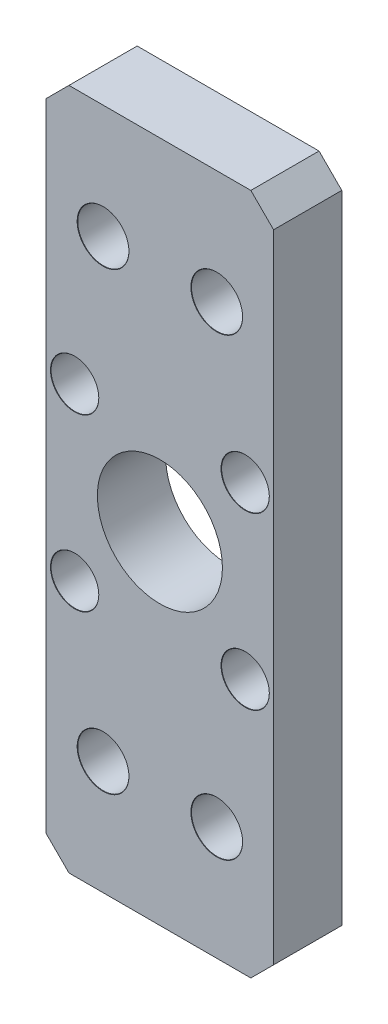
ISO-10303-21;
HEADER;
FILE_DESCRIPTION(('STEP AP214'),'2;1');
FILE_NAME('part.step','',(''),(''),'','','');
FILE_SCHEMA(('AUTOMOTIVE_DESIGN { 1 0 10303 214 1 1 1 1 }'));
ENDSEC;
DATA;
#1=APPLICATION_CONTEXT('core data for automotive mechanical design processes');
#2=APPLICATION_PROTOCOL_DEFINITION('international standard','automotive_design',2000,#1);
#3=PRODUCT_CONTEXT('',#1,'mechanical');
#4=PRODUCT('Part','Part','',(#3));
#5=PRODUCT_RELATED_PRODUCT_CATEGORY('part','',(#4));
#6=PRODUCT_DEFINITION_FORMATION('','',#4);
#7=PRODUCT_DEFINITION_CONTEXT('part definition',#1,'design');
#8=PRODUCT_DEFINITION('design','',#6,#7);
#9=PRODUCT_DEFINITION_SHAPE('','',#8);
#10=(LENGTH_UNIT() NAMED_UNIT(*) SI_UNIT(.MILLI.,.METRE.));
#11=(NAMED_UNIT(*) PLANE_ANGLE_UNIT() SI_UNIT($,.RADIAN.));
#12=(NAMED_UNIT(*) SI_UNIT($,.STERADIAN.) SOLID_ANGLE_UNIT());
#13=UNCERTAINTY_MEASURE_WITH_UNIT(LENGTH_MEASURE(1.E-05),#10,'distance_accuracy_value','');
#14=(GEOMETRIC_REPRESENTATION_CONTEXT(3) GLOBAL_UNCERTAINTY_ASSIGNED_CONTEXT((#13)) GLOBAL_UNIT_ASSIGNED_CONTEXT((#10,
#11,#12)) REPRESENTATION_CONTEXT('',''));
#15=CARTESIAN_POINT('',(0.,0.,0.));
#16=DIRECTION('',(0.,0.,1.));
#17=DIRECTION('',(1.,0.,0.));
#18=AXIS2_PLACEMENT_3D('',#15,#16,#17);
#19=CARTESIAN_POINT('',(10.,-30.,6.));
#20=DIRECTION('',(-1.,0.,0.));
#21=DIRECTION('',(0.,0.,1.));
#22=AXIS2_PLACEMENT_3D('',#19,#20,#21);
#23=PLANE('',#22);
#24=DIRECTION('',(0.,1.,0.));
#25=VECTOR('',#24,1.);
#26=CARTESIAN_POINT('',(10.,-30.,6.));
#27=LINE('',#26,#25);
#28=CARTESIAN_POINT('',(10.,-28.,6.));
#29=VERTEX_POINT('',#28);
#30=CARTESIAN_POINT('',(10.,28.,6.));
#31=VERTEX_POINT('',#30);
#32=EDGE_CURVE('E130',#29,#31,#27,.T.);
#33=ORIENTED_EDGE('',*,*,#32,.F.);
#34=DIRECTION('',(0.,0.,-1.));
#35=VECTOR('',#34,1.);
#36=CARTESIAN_POINT('',(10.,-28.,6.));
#37=LINE('',#36,#35);
#38=CARTESIAN_POINT('',(10.,-28.,0.));
#39=VERTEX_POINT('',#38);
#40=EDGE_CURVE('E114',#29,#39,#37,.T.);
#41=ORIENTED_EDGE('',*,*,#40,.T.);
#42=DIRECTION('',(0.,1.,0.));
#43=VECTOR('',#42,1.);
#44=CARTESIAN_POINT('',(10.,-30.,0.));
#45=LINE('',#44,#43);
#46=CARTESIAN_POINT('',(10.,28.,0.));
#47=VERTEX_POINT('',#46);
#48=EDGE_CURVE('E127',#39,#47,#45,.T.);
#49=ORIENTED_EDGE('',*,*,#48,.T.);
#50=DIRECTION('',(0.,0.,1.));
#51=VECTOR('',#50,1.);
#52=CARTESIAN_POINT('',(10.,28.,6.));
#53=LINE('',#52,#51);
#54=EDGE_CURVE('E133',#47,#31,#53,.T.);
#55=ORIENTED_EDGE('',*,*,#54,.T.);
#56=EDGE_LOOP('',(#33,#41,#49,#55));
#57=FACE_BOUND('',#56,.T.);
#58=ADVANCED_FACE('F41',(#57),#23,.F.);
#59=CARTESIAN_POINT('',(-10.,30.,6.));
#60=DIRECTION('',(0.,-1.,0.));
#61=DIRECTION('',(0.,0.,-1.));
#62=AXIS2_PLACEMENT_3D('',#59,#60,#61);
#63=PLANE('',#62);
#64=DIRECTION('',(-1.,0.,0.));
#65=VECTOR('',#64,1.);
#66=CARTESIAN_POINT('',(-10.,30.,6.));
#67=LINE('',#66,#65);
#68=CARTESIAN_POINT('',(8.,30.,6.));
#69=VERTEX_POINT('',#68);
#70=CARTESIAN_POINT('',(-8.,30.,6.));
#71=VERTEX_POINT('',#70);
#72=EDGE_CURVE('E193',#69,#71,#67,.T.);
#73=ORIENTED_EDGE('',*,*,#72,.F.);
#74=DIRECTION('',(0.,0.,-1.));
#75=VECTOR('',#74,1.);
#76=CARTESIAN_POINT('',(8.,30.,6.));
#77=LINE('',#76,#75);
#78=CARTESIAN_POINT('',(8.,30.,0.));
#79=VERTEX_POINT('',#78);
#80=EDGE_CURVE('E11',#69,#79,#77,.T.);
#81=ORIENTED_EDGE('',*,*,#80,.T.);
#82=DIRECTION('',(-1.,0.,0.));
#83=VECTOR('',#82,1.);
#84=CARTESIAN_POINT('',(-10.,30.,0.));
#85=LINE('',#84,#83);
#86=CARTESIAN_POINT('',(-8.,30.,0.));
#87=VERTEX_POINT('',#86);
#88=EDGE_CURVE('E139',#79,#87,#85,.T.);
#89=ORIENTED_EDGE('',*,*,#88,.T.);
#90=DIRECTION('',(0.,0.,1.));
#91=VECTOR('',#90,1.);
#92=CARTESIAN_POINT('',(-8.,30.,6.));
#93=LINE('',#92,#91);
#94=EDGE_CURVE('E51',#87,#71,#93,.T.);
#95=ORIENTED_EDGE('',*,*,#94,.T.);
#96=EDGE_LOOP('',(#73,#81,#89,#95));
#97=FACE_BOUND('',#96,.T.);
#98=ADVANCED_FACE('F192',(#97),#63,.F.);
#99=CARTESIAN_POINT('',(-10.,-30.,6.));
#100=DIRECTION('',(1.,0.,0.));
#101=DIRECTION('',(0.,0.,-1.));
#102=AXIS2_PLACEMENT_3D('',#99,#100,#101);
#103=PLANE('',#102);
#104=DIRECTION('',(0.,-1.,0.));
#105=VECTOR('',#104,1.);
#106=CARTESIAN_POINT('',(-10.,-30.,0.));
#107=LINE('',#106,#105);
#108=CARTESIAN_POINT('',(-10.,28.,0.));
#109=VERTEX_POINT('',#108);
#110=CARTESIAN_POINT('',(-10.,-28.,0.));
#111=VERTEX_POINT('',#110);
#112=EDGE_CURVE('E145',#109,#111,#107,.T.);
#113=ORIENTED_EDGE('',*,*,#112,.T.);
#114=DIRECTION('',(0.,0.,1.));
#115=VECTOR('',#114,1.);
#116=CARTESIAN_POINT('',(-10.,-28.,6.));
#117=LINE('',#116,#115);
#118=CARTESIAN_POINT('',(-10.,-28.,6.));
#119=VERTEX_POINT('',#118);
#120=EDGE_CURVE('E58',#111,#119,#117,.T.);
#121=ORIENTED_EDGE('',*,*,#120,.T.);
#122=DIRECTION('',(0.,-1.,0.));
#123=VECTOR('',#122,1.);
#124=CARTESIAN_POINT('',(-10.,-30.,6.));
#125=LINE('',#124,#123);
#126=CARTESIAN_POINT('',(-10.,28.,6.));
#127=VERTEX_POINT('',#126);
#128=EDGE_CURVE('E200',#127,#119,#125,.T.);
#129=ORIENTED_EDGE('',*,*,#128,.F.);
#130=DIRECTION('',(0.,0.,-1.));
#131=VECTOR('',#130,1.);
#132=CARTESIAN_POINT('',(-10.,28.,6.));
#133=LINE('',#132,#131);
#134=EDGE_CURVE('E183',#127,#109,#133,.T.);
#135=ORIENTED_EDGE('',*,*,#134,.T.);
#136=EDGE_LOOP('',(#113,#121,#129,#135));
#137=FACE_BOUND('',#136,.T.);
#138=ADVANCED_FACE('F204',(#137),#103,.F.);
#139=CARTESIAN_POINT('',(-10.,-30.,6.));
#140=DIRECTION('',(0.,1.,0.));
#141=DIRECTION('',(0.,0.,1.));
#142=AXIS2_PLACEMENT_3D('',#139,#140,#141);
#143=PLANE('',#142);
#144=DIRECTION('',(1.,0.,0.));
#145=VECTOR('',#144,1.);
#146=CARTESIAN_POINT('',(-10.,-30.,0.));
#147=LINE('',#146,#145);
#148=CARTESIAN_POINT('',(-8.,-30.,0.));
#149=VERTEX_POINT('',#148);
#150=CARTESIAN_POINT('',(8.,-30.,0.));
#151=VERTEX_POINT('',#150);
#152=EDGE_CURVE('E156',#149,#151,#147,.T.);
#153=ORIENTED_EDGE('',*,*,#152,.T.);
#154=DIRECTION('',(0.,0.,1.));
#155=VECTOR('',#154,1.);
#156=CARTESIAN_POINT('',(8.,-30.,6.));
#157=LINE('',#156,#155);
#158=CARTESIAN_POINT('',(8.,-30.,6.));
#159=VERTEX_POINT('',#158);
#160=EDGE_CURVE('E115',#151,#159,#157,.T.);
#161=ORIENTED_EDGE('',*,*,#160,.T.);
#162=DIRECTION('',(1.,0.,0.));
#163=VECTOR('',#162,1.);
#164=CARTESIAN_POINT('',(-10.,-30.,6.));
#165=LINE('',#164,#163);
#166=CARTESIAN_POINT('',(-8.,-30.,6.));
#167=VERTEX_POINT('',#166);
#168=EDGE_CURVE('E151',#167,#159,#165,.T.);
#169=ORIENTED_EDGE('',*,*,#168,.F.);
#170=DIRECTION('',(0.,0.,-1.));
#171=VECTOR('',#170,1.);
#172=CARTESIAN_POINT('',(-8.,-30.,6.));
#173=LINE('',#172,#171);
#174=EDGE_CURVE('E121',#167,#149,#173,.T.);
#175=ORIENTED_EDGE('',*,*,#174,.T.);
#176=EDGE_LOOP('',(#153,#161,#169,#175));
#177=FACE_BOUND('',#176,.T.);
#178=ADVANCED_FACE('F211',(#177),#143,.F.);
#179=CARTESIAN_POINT('',(0.,0.,6.));
#180=DIRECTION('',(0.,0.,-1.));
#181=DIRECTION('',(-1.,0.,0.));
#182=AXIS2_PLACEMENT_3D('',#179,#180,#181);
#183=PLANE('',#182);
#184=CARTESIAN_POINT('',(-7.5,7.5,6.));
#185=DIRECTION('',(0.,0.,1.));
#186=DIRECTION('',(1.,0.,0.));
#187=AXIS2_PLACEMENT_3D('',#184,#185,#186);
#188=CIRCLE('',#187,2.125);
#189=CARTESIAN_POINT('',(-5.375,7.5,6.));
#190=VERTEX_POINT('',#189);
#191=EDGE_CURVE('E312',#190,#190,#188,.T.);
#192=ORIENTED_EDGE('',*,*,#191,.F.);
#193=EDGE_LOOP('',(#192));
#194=FACE_BOUND('',#193,.T.);
#195=CARTESIAN_POINT('',(7.5,7.5,6.));
#196=DIRECTION('',(0.,0.,1.));
#197=DIRECTION('',(1.,0.,0.));
#198=AXIS2_PLACEMENT_3D('',#195,#196,#197);
#199=CIRCLE('',#198,2.125);
#200=CARTESIAN_POINT('',(9.625,7.5,6.));
#201=VERTEX_POINT('',#200);
#202=EDGE_CURVE('E300',#201,#201,#199,.T.);
#203=ORIENTED_EDGE('',*,*,#202,.F.);
#204=EDGE_LOOP('',(#203));
#205=FACE_BOUND('',#204,.T.);
#206=CARTESIAN_POINT('',(7.5,-7.5,6.));
#207=DIRECTION('',(0.,0.,1.));
#208=DIRECTION('',(1.,0.,0.));
#209=AXIS2_PLACEMENT_3D('',#206,#207,#208);
#210=CIRCLE('',#209,2.125);
#211=CARTESIAN_POINT('',(9.625,-7.5,6.));
#212=VERTEX_POINT('',#211);
#213=EDGE_CURVE('E288',#212,#212,#210,.T.);
#214=ORIENTED_EDGE('',*,*,#213,.F.);
#215=EDGE_LOOP('',(#214));
#216=FACE_BOUND('',#215,.T.);
#217=CARTESIAN_POINT('',(-7.5,-7.5,6.));
#218=DIRECTION('',(0.,0.,1.));
#219=DIRECTION('',(1.,0.,0.));
#220=AXIS2_PLACEMENT_3D('',#217,#218,#219);
#221=CIRCLE('',#220,2.125);
#222=CARTESIAN_POINT('',(-5.375,-7.5,6.));
#223=VERTEX_POINT('',#222);
#224=EDGE_CURVE('E276',#223,#223,#221,.T.);
#225=ORIENTED_EDGE('',*,*,#224,.F.);
#226=EDGE_LOOP('',(#225));
#227=FACE_BOUND('',#226,.T.);
#228=CARTESIAN_POINT('',(0.,0.,6.));
#229=DIRECTION('',(0.,0.,1.));
#230=DIRECTION('',(1.,0.,0.));
#231=AXIS2_PLACEMENT_3D('',#228,#229,#230);
#232=CIRCLE('',#231,5.5);
#233=CARTESIAN_POINT('',(5.5,0.,6.));
#234=VERTEX_POINT('',#233);
#235=EDGE_CURVE('E261',#234,#234,#232,.T.);
#236=ORIENTED_EDGE('',*,*,#235,.F.);
#237=EDGE_LOOP('',(#236));
#238=FACE_BOUND('',#237,.T.);
#239=CARTESIAN_POINT('',(-5.,-20.,6.));
#240=DIRECTION('',(0.,0.,1.));
#241=DIRECTION('',(1.,0.,0.));
#242=AXIS2_PLACEMENT_3D('',#239,#240,#241);
#243=CIRCLE('',#242,2.275);
#244=CARTESIAN_POINT('',(-2.725,-20.,6.));
#245=VERTEX_POINT('',#244);
#246=EDGE_CURVE('E256',#245,#245,#243,.T.);
#247=ORIENTED_EDGE('',*,*,#246,.F.);
#248=EDGE_LOOP('',(#247));
#249=FACE_BOUND('',#248,.T.);
#250=CARTESIAN_POINT('',(5.,-20.,6.));
#251=DIRECTION('',(0.,0.,1.));
#252=DIRECTION('',(1.,0.,0.));
#253=AXIS2_PLACEMENT_3D('',#250,#251,#252);
#254=CIRCLE('',#253,2.275);
#255=CARTESIAN_POINT('',(7.275,-20.,6.));
#256=VERTEX_POINT('',#255);
#257=EDGE_CURVE('E244',#256,#256,#254,.T.);
#258=ORIENTED_EDGE('',*,*,#257,.F.);
#259=EDGE_LOOP('',(#258));
#260=FACE_BOUND('',#259,.T.);
#261=CARTESIAN_POINT('',(-5.,20.,6.));
#262=DIRECTION('',(0.,0.,1.));
#263=DIRECTION('',(1.,0.,0.));
#264=AXIS2_PLACEMENT_3D('',#261,#262,#263);
#265=CIRCLE('',#264,2.275);
#266=CARTESIAN_POINT('',(-2.725,20.,6.));
#267=VERTEX_POINT('',#266);
#268=EDGE_CURVE('E232',#267,#267,#265,.T.);
#269=ORIENTED_EDGE('',*,*,#268,.F.);
#270=EDGE_LOOP('',(#269));
#271=FACE_BOUND('',#270,.T.);
#272=CARTESIAN_POINT('',(5.,20.,6.));
#273=DIRECTION('',(0.,0.,1.));
#274=DIRECTION('',(1.,0.,0.));
#275=AXIS2_PLACEMENT_3D('',#272,#273,#274);
#276=CIRCLE('',#275,2.275);
#277=CARTESIAN_POINT('',(7.275,20.,6.));
#278=VERTEX_POINT('',#277);
#279=EDGE_CURVE('E220',#278,#278,#276,.T.);
#280=ORIENTED_EDGE('',*,*,#279,.F.);
#281=EDGE_LOOP('',(#280));
#282=FACE_BOUND('',#281,.T.);
#283=ORIENTED_EDGE('',*,*,#168,.T.);
#284=DIRECTION('',(-0.707106781186548,-0.707106781186548,0.));
#285=VECTOR('',#284,1.);
#286=CARTESIAN_POINT('',(10.,-28.,6.));
#287=LINE('',#286,#285);
#288=EDGE_CURVE('E180',#159,#29,#287,.F.);
#289=ORIENTED_EDGE('',*,*,#288,.T.);
#290=ORIENTED_EDGE('',*,*,#32,.T.);
#291=DIRECTION('',(0.707106781186548,-0.707106781186548,0.));
#292=VECTOR('',#291,1.);
#293=CARTESIAN_POINT('',(8.,30.,6.));
#294=LINE('',#293,#292);
#295=EDGE_CURVE('E174',#31,#69,#294,.F.);
#296=ORIENTED_EDGE('',*,*,#295,.T.);
#297=ORIENTED_EDGE('',*,*,#72,.T.);
#298=DIRECTION('',(0.707106781186548,0.707106781186548,0.));
#299=VECTOR('',#298,1.);
#300=CARTESIAN_POINT('',(-10.,28.,6.));
#301=LINE('',#300,#299);
#302=EDGE_CURVE('E65',#71,#127,#301,.F.);
#303=ORIENTED_EDGE('',*,*,#302,.T.);
#304=ORIENTED_EDGE('',*,*,#128,.T.);
#305=DIRECTION('',(-0.707106781186548,0.707106781186548,0.));
#306=VECTOR('',#305,1.);
#307=CARTESIAN_POINT('',(-8.,-30.,6.));
#308=LINE('',#307,#306);
#309=EDGE_CURVE('E177',#119,#167,#308,.F.);
#310=ORIENTED_EDGE('',*,*,#309,.T.);
#311=EDGE_LOOP('',(#283,#289,#290,#296,#297,#303,#304,#310));
#312=FACE_BOUND('',#311,.T.);
#313=ADVANCED_FACE('F197',(#194,#205,#216,#227,#238,#249,#260,#271,#282,#312),#183,.F.);
#314=CARTESIAN_POINT('',(0.,0.,0.));
#315=DIRECTION('',(0.,0.,-1.));
#316=DIRECTION('',(-1.,0.,0.));
#317=AXIS2_PLACEMENT_3D('',#314,#315,#316);
#318=PLANE('',#317);
#319=CARTESIAN_POINT('',(-7.5,7.5,0.));
#320=DIRECTION('',(0.,0.,1.));
#321=DIRECTION('',(1.,0.,0.));
#322=AXIS2_PLACEMENT_3D('',#319,#320,#321);
#323=CIRCLE('',#322,2.1);
#324=CARTESIAN_POINT('',(-5.4,7.5,0.));
#325=VERTEX_POINT('',#324);
#326=EDGE_CURVE('E304',#325,#325,#323,.T.);
#327=ORIENTED_EDGE('',*,*,#326,.T.);
#328=EDGE_LOOP('',(#327));
#329=FACE_BOUND('',#328,.T.);
#330=CARTESIAN_POINT('',(7.5,7.5,0.));
#331=DIRECTION('',(0.,0.,1.));
#332=DIRECTION('',(1.,0.,0.));
#333=AXIS2_PLACEMENT_3D('',#330,#331,#332);
#334=CIRCLE('',#333,2.1);
#335=CARTESIAN_POINT('',(9.6,7.5,0.));
#336=VERTEX_POINT('',#335);
#337=EDGE_CURVE('E292',#336,#336,#334,.T.);
#338=ORIENTED_EDGE('',*,*,#337,.T.);
#339=EDGE_LOOP('',(#338));
#340=FACE_BOUND('',#339,.T.);
#341=CARTESIAN_POINT('',(7.5,-7.5,0.));
#342=DIRECTION('',(0.,0.,1.));
#343=DIRECTION('',(1.,0.,0.));
#344=AXIS2_PLACEMENT_3D('',#341,#342,#343);
#345=CIRCLE('',#344,2.1);
#346=CARTESIAN_POINT('',(9.6,-7.5,0.));
#347=VERTEX_POINT('',#346);
#348=EDGE_CURVE('E280',#347,#347,#345,.T.);
#349=ORIENTED_EDGE('',*,*,#348,.T.);
#350=EDGE_LOOP('',(#349));
#351=FACE_BOUND('',#350,.T.);
#352=CARTESIAN_POINT('',(-7.5,-7.5,0.));
#353=DIRECTION('',(0.,0.,1.));
#354=DIRECTION('',(1.,0.,0.));
#355=AXIS2_PLACEMENT_3D('',#352,#353,#354);
#356=CIRCLE('',#355,2.1);
#357=CARTESIAN_POINT('',(-5.4,-7.5,0.));
#358=VERTEX_POINT('',#357);
#359=EDGE_CURVE('E265',#358,#358,#356,.T.);
#360=ORIENTED_EDGE('',*,*,#359,.T.);
#361=EDGE_LOOP('',(#360));
#362=FACE_BOUND('',#361,.T.);
#363=CARTESIAN_POINT('',(0.,0.,0.));
#364=DIRECTION('',(0.,0.,1.));
#365=DIRECTION('',(1.,0.,0.));
#366=AXIS2_PLACEMENT_3D('',#363,#364,#365);
#367=CIRCLE('',#366,5.5);
#368=CARTESIAN_POINT('',(5.5,0.,0.));
#369=VERTEX_POINT('',#368);
#370=EDGE_CURVE('E260',#369,#369,#367,.T.);
#371=ORIENTED_EDGE('',*,*,#370,.T.);
#372=EDGE_LOOP('',(#371));
#373=FACE_BOUND('',#372,.T.);
#374=CARTESIAN_POINT('',(-5.,-20.,0.));
#375=DIRECTION('',(0.,0.,1.));
#376=DIRECTION('',(1.,0.,0.));
#377=AXIS2_PLACEMENT_3D('',#374,#375,#376);
#378=CIRCLE('',#377,2.25);
#379=CARTESIAN_POINT('',(-2.75,-20.,0.));
#380=VERTEX_POINT('',#379);
#381=EDGE_CURVE('E248',#380,#380,#378,.T.);
#382=ORIENTED_EDGE('',*,*,#381,.T.);
#383=EDGE_LOOP('',(#382));
#384=FACE_BOUND('',#383,.T.);
#385=CARTESIAN_POINT('',(5.,-20.,0.));
#386=DIRECTION('',(0.,0.,1.));
#387=DIRECTION('',(1.,0.,0.));
#388=AXIS2_PLACEMENT_3D('',#385,#386,#387);
#389=CIRCLE('',#388,2.25);
#390=CARTESIAN_POINT('',(7.25,-20.,0.));
#391=VERTEX_POINT('',#390);
#392=EDGE_CURVE('E236',#391,#391,#389,.T.);
#393=ORIENTED_EDGE('',*,*,#392,.T.);
#394=EDGE_LOOP('',(#393));
#395=FACE_BOUND('',#394,.T.);
#396=CARTESIAN_POINT('',(-5.,20.,0.));
#397=DIRECTION('',(0.,0.,1.));
#398=DIRECTION('',(1.,0.,0.));
#399=AXIS2_PLACEMENT_3D('',#396,#397,#398);
#400=CIRCLE('',#399,2.25);
#401=CARTESIAN_POINT('',(-2.75,20.,0.));
#402=VERTEX_POINT('',#401);
#403=EDGE_CURVE('E224',#402,#402,#400,.T.);
#404=ORIENTED_EDGE('',*,*,#403,.T.);
#405=EDGE_LOOP('',(#404));
#406=FACE_BOUND('',#405,.T.);
#407=CARTESIAN_POINT('',(5.,20.,0.));
#408=DIRECTION('',(0.,0.,1.));
#409=DIRECTION('',(1.,0.,0.));
#410=AXIS2_PLACEMENT_3D('',#407,#408,#409);
#411=CIRCLE('',#410,2.25);
#412=CARTESIAN_POINT('',(7.25,20.,0.));
#413=VERTEX_POINT('',#412);
#414=EDGE_CURVE('E140',#413,#413,#411,.T.);
#415=ORIENTED_EDGE('',*,*,#414,.T.);
#416=EDGE_LOOP('',(#415));
#417=FACE_BOUND('',#416,.T.);
#418=ORIENTED_EDGE('',*,*,#48,.F.);
#419=DIRECTION('',(0.707106781186548,0.707106781186548,0.));
#420=VECTOR('',#419,1.);
#421=CARTESIAN_POINT('',(19.,-19.,0.));
#422=LINE('',#421,#420);
#423=EDGE_CURVE('E110',#39,#151,#422,.F.);
#424=ORIENTED_EDGE('',*,*,#423,.T.);
#425=ORIENTED_EDGE('',*,*,#152,.F.);
#426=DIRECTION('',(0.707106781186548,-0.707106781186548,0.));
#427=VECTOR('',#426,1.);
#428=CARTESIAN_POINT('',(-19.,-19.,0.));
#429=LINE('',#428,#427);
#430=EDGE_CURVE('E122',#149,#111,#429,.F.);
#431=ORIENTED_EDGE('',*,*,#430,.T.);
#432=ORIENTED_EDGE('',*,*,#112,.F.);
#433=DIRECTION('',(-0.707106781186548,-0.707106781186548,0.));
#434=VECTOR('',#433,1.);
#435=CARTESIAN_POINT('',(-19.,19.,0.));
#436=LINE('',#435,#434);
#437=EDGE_CURVE('E132',#109,#87,#436,.F.);
#438=ORIENTED_EDGE('',*,*,#437,.T.);
#439=ORIENTED_EDGE('',*,*,#88,.F.);
#440=DIRECTION('',(-0.707106781186548,0.707106781186548,0.));
#441=VECTOR('',#440,1.);
#442=CARTESIAN_POINT('',(19.,19.,0.));
#443=LINE('',#442,#441);
#444=EDGE_CURVE('E137',#79,#47,#443,.F.);
#445=ORIENTED_EDGE('',*,*,#444,.T.);
#446=EDGE_LOOP('',(#418,#424,#425,#431,#432,#438,#439,#445));
#447=FACE_BOUND('',#446,.T.);
#448=ADVANCED_FACE('F135',(#329,#340,#351,#362,#373,#384,#395,#406,#417,#447),#318,.T.);
#449=CARTESIAN_POINT('',(5.,20.,6.));
#450=DIRECTION('',(0.,0.,1.));
#451=DIRECTION('',(1.,0.,0.));
#452=AXIS2_PLACEMENT_3D('',#449,#450,#451);
#453=CYLINDRICAL_SURFACE('',#452,2.25);
#454=ORIENTED_EDGE('',*,*,#414,.F.);
#455=EDGE_LOOP('',(#454));
#456=FACE_BOUND('',#455,.T.);
#457=CARTESIAN_POINT('',(5.,20.,5.975));
#458=DIRECTION('',(0.,0.,1.));
#459=DIRECTION('',(1.,0.,0.));
#460=AXIS2_PLACEMENT_3D('',#457,#458,#459);
#461=CIRCLE('',#460,2.25);
#462=CARTESIAN_POINT('',(7.25,20.,5.975));
#463=VERTEX_POINT('',#462);
#464=EDGE_CURVE('E148',#463,#463,#461,.T.);
#465=ORIENTED_EDGE('',*,*,#464,.T.);
#466=EDGE_LOOP('',(#465));
#467=FACE_BOUND('',#466,.T.);
#468=ADVANCED_FACE('F341',(#456,#467),#453,.F.);
#469=CARTESIAN_POINT('',(5.,20.,6.));
#470=DIRECTION('',(0.,0.,1.));
#471=DIRECTION('',(1.,0.,0.));
#472=AXIS2_PLACEMENT_3D('',#469,#470,#471);
#473=CONICAL_SURFACE('',#472,2.275,0.785398163397466);
#474=ORIENTED_EDGE('',*,*,#464,.F.);
#475=EDGE_LOOP('',(#474));
#476=FACE_BOUND('',#475,.T.);
#477=ORIENTED_EDGE('',*,*,#279,.T.);
#478=EDGE_LOOP('',(#477));
#479=FACE_BOUND('',#478,.T.);
#480=ADVANCED_FACE('F338',(#476,#479),#473,.F.);
#481=CARTESIAN_POINT('',(-5.,20.,6.));
#482=DIRECTION('',(0.,0.,1.));
#483=DIRECTION('',(1.,0.,0.));
#484=AXIS2_PLACEMENT_3D('',#481,#482,#483);
#485=CYLINDRICAL_SURFACE('',#484,2.25);
#486=ORIENTED_EDGE('',*,*,#403,.F.);
#487=EDGE_LOOP('',(#486));
#488=FACE_BOUND('',#487,.T.);
#489=CARTESIAN_POINT('',(-5.,20.,5.975));
#490=DIRECTION('',(0.,0.,1.));
#491=DIRECTION('',(1.,0.,0.));
#492=AXIS2_PLACEMENT_3D('',#489,#490,#491);
#493=CIRCLE('',#492,2.25);
#494=CARTESIAN_POINT('',(-2.75,20.,5.975));
#495=VERTEX_POINT('',#494);
#496=EDGE_CURVE('E228',#495,#495,#493,.T.);
#497=ORIENTED_EDGE('',*,*,#496,.T.);
#498=EDGE_LOOP('',(#497));
#499=FACE_BOUND('',#498,.T.);
#500=ADVANCED_FACE('F340',(#488,#499),#485,.F.);
#501=CARTESIAN_POINT('',(-5.,20.,6.));
#502=DIRECTION('',(0.,0.,1.));
#503=DIRECTION('',(1.,0.,0.));
#504=AXIS2_PLACEMENT_3D('',#501,#502,#503);
#505=CONICAL_SURFACE('',#504,2.275,0.785398163397457);
#506=ORIENTED_EDGE('',*,*,#496,.F.);
#507=EDGE_LOOP('',(#506));
#508=FACE_BOUND('',#507,.T.);
#509=ORIENTED_EDGE('',*,*,#268,.T.);
#510=EDGE_LOOP('',(#509));
#511=FACE_BOUND('',#510,.T.);
#512=ADVANCED_FACE('F348',(#508,#511),#505,.F.);
#513=CARTESIAN_POINT('',(5.,-20.,6.));
#514=DIRECTION('',(0.,0.,1.));
#515=DIRECTION('',(1.,0.,0.));
#516=AXIS2_PLACEMENT_3D('',#513,#514,#515);
#517=CYLINDRICAL_SURFACE('',#516,2.25);
#518=ORIENTED_EDGE('',*,*,#392,.F.);
#519=EDGE_LOOP('',(#518));
#520=FACE_BOUND('',#519,.T.);
#521=CARTESIAN_POINT('',(5.,-20.,5.975));
#522=DIRECTION('',(0.,0.,1.));
#523=DIRECTION('',(1.,0.,0.));
#524=AXIS2_PLACEMENT_3D('',#521,#522,#523);
#525=CIRCLE('',#524,2.25);
#526=CARTESIAN_POINT('',(7.25,-20.,5.975));
#527=VERTEX_POINT('',#526);
#528=EDGE_CURVE('E240',#527,#527,#525,.T.);
#529=ORIENTED_EDGE('',*,*,#528,.T.);
#530=EDGE_LOOP('',(#529));
#531=FACE_BOUND('',#530,.T.);
#532=ADVANCED_FACE('F558',(#520,#531),#517,.F.);
#533=CARTESIAN_POINT('',(5.,-20.,6.));
#534=DIRECTION('',(0.,0.,1.));
#535=DIRECTION('',(1.,0.,0.));
#536=AXIS2_PLACEMENT_3D('',#533,#534,#535);
#537=CONICAL_SURFACE('',#536,2.275,0.785398163397466);
#538=ORIENTED_EDGE('',*,*,#528,.F.);
#539=EDGE_LOOP('',(#538));
#540=FACE_BOUND('',#539,.T.);
#541=ORIENTED_EDGE('',*,*,#257,.T.);
#542=EDGE_LOOP('',(#541));
#543=FACE_BOUND('',#542,.T.);
#544=ADVANCED_FACE('F548',(#540,#543),#537,.F.);
#545=CARTESIAN_POINT('',(-5.,-20.,6.));
#546=DIRECTION('',(0.,0.,1.));
#547=DIRECTION('',(1.,0.,0.));
#548=AXIS2_PLACEMENT_3D('',#545,#546,#547);
#549=CYLINDRICAL_SURFACE('',#548,2.25);
#550=ORIENTED_EDGE('',*,*,#381,.F.);
#551=EDGE_LOOP('',(#550));
#552=FACE_BOUND('',#551,.T.);
#553=CARTESIAN_POINT('',(-5.,-20.,5.975));
#554=DIRECTION('',(0.,0.,1.));
#555=DIRECTION('',(1.,0.,0.));
#556=AXIS2_PLACEMENT_3D('',#553,#554,#555);
#557=CIRCLE('',#556,2.25);
#558=CARTESIAN_POINT('',(-2.75,-20.,5.975));
#559=VERTEX_POINT('',#558);
#560=EDGE_CURVE('E252',#559,#559,#557,.T.);
#561=ORIENTED_EDGE('',*,*,#560,.T.);
#562=EDGE_LOOP('',(#561));
#563=FACE_BOUND('',#562,.T.);
#564=ADVANCED_FACE('F538',(#552,#563),#549,.F.);
#565=CARTESIAN_POINT('',(-5.,-20.,6.));
#566=DIRECTION('',(0.,0.,1.));
#567=DIRECTION('',(1.,0.,0.));
#568=AXIS2_PLACEMENT_3D('',#565,#566,#567);
#569=CONICAL_SURFACE('',#568,2.275,0.785398163397457);
#570=ORIENTED_EDGE('',*,*,#560,.F.);
#571=EDGE_LOOP('',(#570));
#572=FACE_BOUND('',#571,.T.);
#573=ORIENTED_EDGE('',*,*,#246,.T.);
#574=EDGE_LOOP('',(#573));
#575=FACE_BOUND('',#574,.T.);
#576=ADVANCED_FACE('F528',(#572,#575),#569,.F.);
#577=CARTESIAN_POINT('',(0.,0.,0.));
#578=DIRECTION('',(0.,0.,1.));
#579=DIRECTION('',(1.,0.,0.));
#580=AXIS2_PLACEMENT_3D('',#577,#578,#579);
#581=CYLINDRICAL_SURFACE('',#580,5.5);
#582=ORIENTED_EDGE('',*,*,#370,.F.);
#583=EDGE_LOOP('',(#582));
#584=FACE_BOUND('',#583,.T.);
#585=ORIENTED_EDGE('',*,*,#235,.T.);
#586=EDGE_LOOP('',(#585));
#587=FACE_BOUND('',#586,.T.);
#588=ADVANCED_FACE('F518',(#584,#587),#581,.F.);
#589=CARTESIAN_POINT('',(-7.5,-7.5,6.));
#590=DIRECTION('',(0.,0.,1.));
#591=DIRECTION('',(1.,0.,0.));
#592=AXIS2_PLACEMENT_3D('',#589,#590,#591);
#593=CYLINDRICAL_SURFACE('',#592,2.09999999999999);
#594=ORIENTED_EDGE('',*,*,#359,.F.);
#595=EDGE_LOOP('',(#594));
#596=FACE_BOUND('',#595,.T.);
#597=CARTESIAN_POINT('',(-7.5,-7.5,5.975));
#598=DIRECTION('',(0.,0.,1.));
#599=DIRECTION('',(1.,0.,0.));
#600=AXIS2_PLACEMENT_3D('',#597,#598,#599);
#601=CIRCLE('',#600,2.09999999999999);
#602=CARTESIAN_POINT('',(-5.40000000000001,-7.5,5.975));
#603=VERTEX_POINT('',#602);
#604=EDGE_CURVE('E272',#603,#603,#601,.T.);
#605=ORIENTED_EDGE('',*,*,#604,.T.);
#606=EDGE_LOOP('',(#605));
#607=FACE_BOUND('',#606,.T.);
#608=ADVANCED_FACE('F508',(#596,#607),#593,.F.);
#609=CARTESIAN_POINT('',(-7.5,-7.5,6.));
#610=DIRECTION('',(0.,0.,1.));
#611=DIRECTION('',(1.,0.,0.));
#612=AXIS2_PLACEMENT_3D('',#609,#610,#611);
#613=CONICAL_SURFACE('',#612,2.125,0.785398163397726);
#614=ORIENTED_EDGE('',*,*,#604,.F.);
#615=EDGE_LOOP('',(#614));
#616=FACE_BOUND('',#615,.T.);
#617=ORIENTED_EDGE('',*,*,#224,.T.);
#618=EDGE_LOOP('',(#617));
#619=FACE_BOUND('',#618,.T.);
#620=ADVANCED_FACE('F498',(#616,#619),#613,.F.);
#621=CARTESIAN_POINT('',(7.5,-7.5,6.));
#622=DIRECTION('',(0.,0.,1.));
#623=DIRECTION('',(1.,0.,0.));
#624=AXIS2_PLACEMENT_3D('',#621,#622,#623);
#625=CYLINDRICAL_SURFACE('',#624,2.09999999999999);
#626=ORIENTED_EDGE('',*,*,#348,.F.);
#627=EDGE_LOOP('',(#626));
#628=FACE_BOUND('',#627,.T.);
#629=CARTESIAN_POINT('',(7.5,-7.5,5.975));
#630=DIRECTION('',(0.,0.,1.));
#631=DIRECTION('',(1.,0.,0.));
#632=AXIS2_PLACEMENT_3D('',#629,#630,#631);
#633=CIRCLE('',#632,2.09999999999999);
#634=CARTESIAN_POINT('',(9.59999999999999,-7.5,5.975));
#635=VERTEX_POINT('',#634);
#636=EDGE_CURVE('E284',#635,#635,#633,.T.);
#637=ORIENTED_EDGE('',*,*,#636,.T.);
#638=EDGE_LOOP('',(#637));
#639=FACE_BOUND('',#638,.T.);
#640=ADVANCED_FACE('F488',(#628,#639),#625,.F.);
#641=CARTESIAN_POINT('',(7.5,-7.5,6.));
#642=DIRECTION('',(0.,0.,1.));
#643=DIRECTION('',(1.,0.,0.));
#644=AXIS2_PLACEMENT_3D('',#641,#642,#643);
#645=CONICAL_SURFACE('',#644,2.125,0.785398163397726);
#646=ORIENTED_EDGE('',*,*,#636,.F.);
#647=EDGE_LOOP('',(#646));
#648=FACE_BOUND('',#647,.T.);
#649=ORIENTED_EDGE('',*,*,#213,.T.);
#650=EDGE_LOOP('',(#649));
#651=FACE_BOUND('',#650,.T.);
#652=ADVANCED_FACE('F478',(#648,#651),#645,.F.);
#653=CARTESIAN_POINT('',(7.5,7.5,6.));
#654=DIRECTION('',(0.,0.,1.));
#655=DIRECTION('',(1.,0.,0.));
#656=AXIS2_PLACEMENT_3D('',#653,#654,#655);
#657=CYLINDRICAL_SURFACE('',#656,2.09999999999999);
#658=ORIENTED_EDGE('',*,*,#337,.F.);
#659=EDGE_LOOP('',(#658));
#660=FACE_BOUND('',#659,.T.);
#661=CARTESIAN_POINT('',(7.5,7.5,5.975));
#662=DIRECTION('',(0.,0.,1.));
#663=DIRECTION('',(1.,0.,0.));
#664=AXIS2_PLACEMENT_3D('',#661,#662,#663);
#665=CIRCLE('',#664,2.09999999999999);
#666=CARTESIAN_POINT('',(9.59999999999999,7.5,5.975));
#667=VERTEX_POINT('',#666);
#668=EDGE_CURVE('E296',#667,#667,#665,.T.);
#669=ORIENTED_EDGE('',*,*,#668,.T.);
#670=EDGE_LOOP('',(#669));
#671=FACE_BOUND('',#670,.T.);
#672=ADVANCED_FACE('F468',(#660,#671),#657,.F.);
#673=CARTESIAN_POINT('',(7.5,7.5,6.));
#674=DIRECTION('',(0.,0.,1.));
#675=DIRECTION('',(1.,0.,0.));
#676=AXIS2_PLACEMENT_3D('',#673,#674,#675);
#677=CONICAL_SURFACE('',#676,2.125,0.785398163397726);
#678=ORIENTED_EDGE('',*,*,#668,.F.);
#679=EDGE_LOOP('',(#678));
#680=FACE_BOUND('',#679,.T.);
#681=ORIENTED_EDGE('',*,*,#202,.T.);
#682=EDGE_LOOP('',(#681));
#683=FACE_BOUND('',#682,.T.);
#684=ADVANCED_FACE('F458',(#680,#683),#677,.F.);
#685=CARTESIAN_POINT('',(-7.5,7.5,6.));
#686=DIRECTION('',(0.,0.,1.));
#687=DIRECTION('',(1.,0.,0.));
#688=AXIS2_PLACEMENT_3D('',#685,#686,#687);
#689=CYLINDRICAL_SURFACE('',#688,2.09999999999999);
#690=ORIENTED_EDGE('',*,*,#326,.F.);
#691=EDGE_LOOP('',(#690));
#692=FACE_BOUND('',#691,.T.);
#693=CARTESIAN_POINT('',(-7.5,7.5,5.975));
#694=DIRECTION('',(0.,0.,1.));
#695=DIRECTION('',(1.,0.,0.));
#696=AXIS2_PLACEMENT_3D('',#693,#694,#695);
#697=CIRCLE('',#696,2.09999999999999);
#698=CARTESIAN_POINT('',(-5.40000000000001,7.5,5.975));
#699=VERTEX_POINT('',#698);
#700=EDGE_CURVE('E308',#699,#699,#697,.T.);
#701=ORIENTED_EDGE('',*,*,#700,.T.);
#702=EDGE_LOOP('',(#701));
#703=FACE_BOUND('',#702,.T.);
#704=ADVANCED_FACE('F448',(#692,#703),#689,.F.);
#705=CARTESIAN_POINT('',(-7.5,7.5,6.));
#706=DIRECTION('',(0.,0.,1.));
#707=DIRECTION('',(1.,0.,0.));
#708=AXIS2_PLACEMENT_3D('',#705,#706,#707);
#709=CONICAL_SURFACE('',#708,2.125,0.785398163397726);
#710=ORIENTED_EDGE('',*,*,#700,.F.);
#711=EDGE_LOOP('',(#710));
#712=FACE_BOUND('',#711,.T.);
#713=ORIENTED_EDGE('',*,*,#191,.T.);
#714=EDGE_LOOP('',(#713));
#715=FACE_BOUND('',#714,.T.);
#716=ADVANCED_FACE('F317',(#712,#715),#709,.F.);
#717=CARTESIAN_POINT('',(10.,-28.,6.));
#718=DIRECTION('',(-0.707106781186547,0.707106781186547,0.));
#719=DIRECTION('',(0.,0.,-1.));
#720=AXIS2_PLACEMENT_3D('',#717,#718,#719);
#721=PLANE('',#720);
#722=ORIENTED_EDGE('',*,*,#288,.F.);
#723=ORIENTED_EDGE('',*,*,#160,.F.);
#724=ORIENTED_EDGE('',*,*,#423,.F.);
#725=ORIENTED_EDGE('',*,*,#40,.F.);
#726=EDGE_LOOP('',(#722,#723,#724,#725));
#727=FACE_BOUND('',#726,.T.);
#728=ADVANCED_FACE('F113',(#727),#721,.F.);
#729=CARTESIAN_POINT('',(-8.,-30.,6.));
#730=DIRECTION('',(0.707106781186547,0.707106781186547,0.));
#731=DIRECTION('',(0.,0.,-1.));
#732=AXIS2_PLACEMENT_3D('',#729,#730,#731);
#733=PLANE('',#732);
#734=ORIENTED_EDGE('',*,*,#309,.F.);
#735=ORIENTED_EDGE('',*,*,#120,.F.);
#736=ORIENTED_EDGE('',*,*,#430,.F.);
#737=ORIENTED_EDGE('',*,*,#174,.F.);
#738=EDGE_LOOP('',(#734,#735,#736,#737));
#739=FACE_BOUND('',#738,.T.);
#740=ADVANCED_FACE('F208',(#739),#733,.F.);
#741=CARTESIAN_POINT('',(8.,30.,6.));
#742=DIRECTION('',(-0.707106781186547,-0.707106781186547,0.));
#743=DIRECTION('',(0.,0.,-1.));
#744=AXIS2_PLACEMENT_3D('',#741,#742,#743);
#745=PLANE('',#744);
#746=ORIENTED_EDGE('',*,*,#295,.F.);
#747=ORIENTED_EDGE('',*,*,#54,.F.);
#748=ORIENTED_EDGE('',*,*,#444,.F.);
#749=ORIENTED_EDGE('',*,*,#80,.F.);
#750=EDGE_LOOP('',(#746,#747,#748,#749));
#751=FACE_BOUND('',#750,.T.);
#752=ADVANCED_FACE('F372',(#751),#745,.F.);
#753=CARTESIAN_POINT('',(-10.,28.,6.));
#754=DIRECTION('',(0.707106781186547,-0.707106781186547,0.));
#755=DIRECTION('',(0.,0.,-1.));
#756=AXIS2_PLACEMENT_3D('',#753,#754,#755);
#757=PLANE('',#756);
#758=ORIENTED_EDGE('',*,*,#302,.F.);
#759=ORIENTED_EDGE('',*,*,#94,.F.);
#760=ORIENTED_EDGE('',*,*,#437,.F.);
#761=ORIENTED_EDGE('',*,*,#134,.F.);
#762=EDGE_LOOP('',(#758,#759,#760,#761));
#763=FACE_BOUND('',#762,.T.);
#764=ADVANCED_FACE('F44',(#763),#757,.F.);
#765=CLOSED_SHELL('',(#58,#98,#138,#178,#313,#448,#468,#480,#500,#512,#532,#544,#564,#576,#588,
#608,#620,#640,#652,#672,#684,#704,#716,#728,#740,#752,#764));
#766=MANIFOLD_SOLID_BREP('B2',#765);
#767=ADVANCED_BREP_SHAPE_REPRESENTATION('',(#18,#766),#14);
#768=SHAPE_DEFINITION_REPRESENTATION(#9,#767);
ENDSEC;
END-ISO-10303-21;
